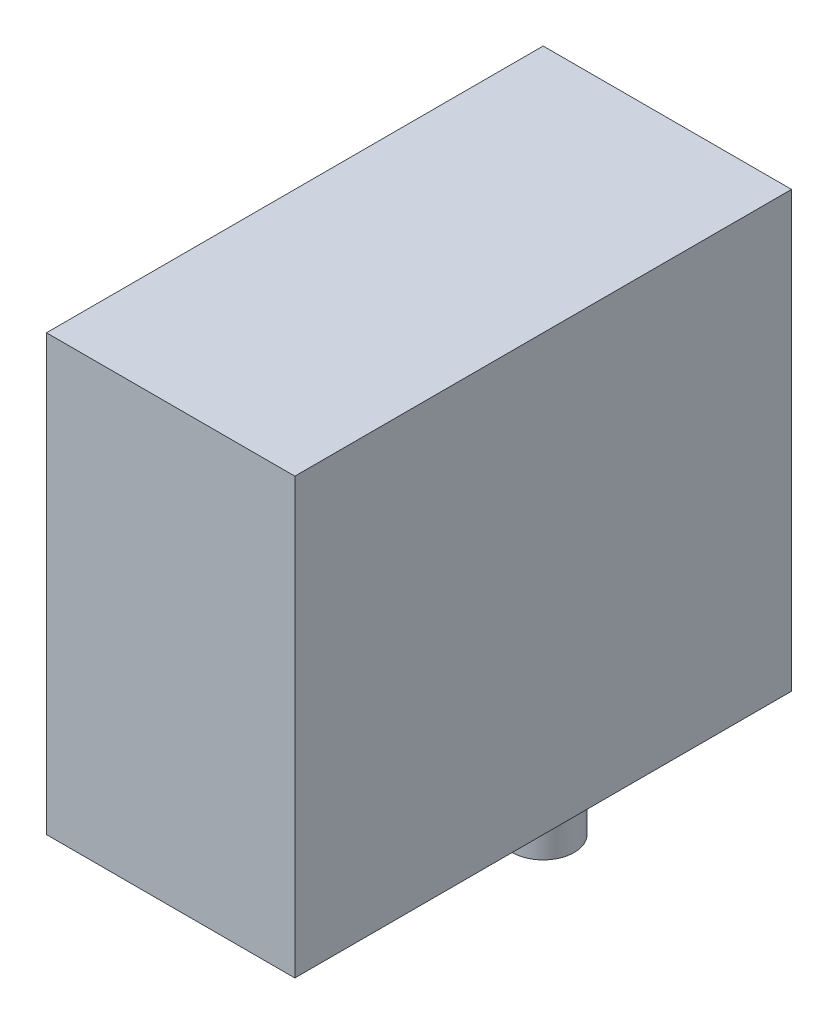
ISO-10303-21;
HEADER;
FILE_DESCRIPTION(('STEP AP214'),'2;1');
FILE_NAME('part.step','',(''),(''),'','','');
FILE_SCHEMA(('AUTOMOTIVE_DESIGN { 1 0 10303 214 1 1 1 1 }'));
ENDSEC;
DATA;
#1=APPLICATION_CONTEXT('core data for automotive mechanical design processes');
#2=APPLICATION_PROTOCOL_DEFINITION('international standard','automotive_design',2000,#1);
#3=PRODUCT_CONTEXT('',#1,'mechanical');
#4=PRODUCT('Part','Part','',(#3));
#5=PRODUCT_RELATED_PRODUCT_CATEGORY('part','',(#4));
#6=PRODUCT_DEFINITION_FORMATION('','',#4);
#7=PRODUCT_DEFINITION_CONTEXT('part definition',#1,'design');
#8=PRODUCT_DEFINITION('design','',#6,#7);
#9=PRODUCT_DEFINITION_SHAPE('','',#8);
#10=(LENGTH_UNIT() NAMED_UNIT(*) SI_UNIT(.MILLI.,.METRE.));
#11=(NAMED_UNIT(*) PLANE_ANGLE_UNIT() SI_UNIT($,.RADIAN.));
#12=(NAMED_UNIT(*) SI_UNIT($,.STERADIAN.) SOLID_ANGLE_UNIT());
#13=UNCERTAINTY_MEASURE_WITH_UNIT(LENGTH_MEASURE(1.E-05),#10,'distance_accuracy_value','');
#14=(GEOMETRIC_REPRESENTATION_CONTEXT(3) GLOBAL_UNCERTAINTY_ASSIGNED_CONTEXT((#13)) GLOBAL_UNIT_ASSIGNED_CONTEXT((#10,
#11,#12)) REPRESENTATION_CONTEXT('',''));
#15=CARTESIAN_POINT('',(0.,0.,0.));
#16=DIRECTION('',(0.,0.,1.));
#17=DIRECTION('',(1.,0.,0.));
#18=AXIS2_PLACEMENT_3D('',#15,#16,#17);
#19=CARTESIAN_POINT('',(0.,10.,0.));
#20=DIRECTION('',(0.,-1.,0.));
#21=DIRECTION('',(0.,0.,-1.));
#22=AXIS2_PLACEMENT_3D('',#19,#20,#21);
#23=CYLINDRICAL_SURFACE('',#22,2.5);
#24=CARTESIAN_POINT('',(0.,10.,0.));
#25=DIRECTION('',(0.,1.,0.));
#26=DIRECTION('',(0.,0.,1.));
#27=AXIS2_PLACEMENT_3D('',#24,#25,#26);
#28=CIRCLE('',#27,2.5);
#29=CARTESIAN_POINT('',(0.,10.,2.5));
#30=VERTEX_POINT('',#29);
#31=EDGE_CURVE('E11',#30,#30,#28,.T.);
#32=ORIENTED_EDGE('',*,*,#31,.F.);
#33=EDGE_LOOP('',(#32));
#34=FACE_BOUND('',#33,.T.);
#35=CARTESIAN_POINT('',(0.,0.,0.));
#36=DIRECTION('',(0.,1.,0.));
#37=DIRECTION('',(0.,0.,1.));
#38=AXIS2_PLACEMENT_3D('',#35,#36,#37);
#39=CIRCLE('',#38,2.5);
#40=CARTESIAN_POINT('',(0.,0.,2.5));
#41=VERTEX_POINT('',#40);
#42=EDGE_CURVE('E39',#41,#41,#39,.T.);
#43=ORIENTED_EDGE('',*,*,#42,.T.);
#44=EDGE_LOOP('',(#43));
#45=FACE_BOUND('',#44,.T.);
#46=ADVANCED_FACE('F36',(#34,#45),#23,.T.);
#47=CARTESIAN_POINT('',(0.,0.,0.));
#48=DIRECTION('',(0.,1.,0.));
#49=DIRECTION('',(0.,0.,1.));
#50=AXIS2_PLACEMENT_3D('',#47,#48,#49);
#51=PLANE('',#50);
#52=ORIENTED_EDGE('',*,*,#42,.F.);
#53=EDGE_LOOP('',(#52));
#54=FACE_BOUND('',#53,.T.);
#55=ADVANCED_FACE('F115',(#54),#51,.F.);
#56=CARTESIAN_POINT('',(10.,45.,-10.));
#57=DIRECTION('',(-1.,0.,0.));
#58=DIRECTION('',(0.,0.,1.));
#59=AXIS2_PLACEMENT_3D('',#56,#57,#58);
#60=PLANE('',#59);
#61=DIRECTION('',(0.,0.,-1.));
#62=VECTOR('',#61,1.);
#63=CARTESIAN_POINT('',(10.,10.,-10.));
#64=LINE('',#63,#62);
#65=CARTESIAN_POINT('',(10.,10.,30.));
#66=VERTEX_POINT('',#65);
#67=CARTESIAN_POINT('',(10.,10.,-10.));
#68=VERTEX_POINT('',#67);
#69=EDGE_CURVE('E103',#66,#68,#64,.T.);
#70=ORIENTED_EDGE('',*,*,#69,.T.);
#71=DIRECTION('',(0.,-1.,0.));
#72=VECTOR('',#71,1.);
#73=CARTESIAN_POINT('',(10.,45.,-10.));
#74=LINE('',#73,#72);
#75=CARTESIAN_POINT('',(10.,45.,-10.));
#76=VERTEX_POINT('',#75);
#77=EDGE_CURVE('E94',#76,#68,#74,.T.);
#78=ORIENTED_EDGE('',*,*,#77,.F.);
#79=DIRECTION('',(0.,0.,-1.));
#80=VECTOR('',#79,1.);
#81=CARTESIAN_POINT('',(10.,45.,-10.));
#82=LINE('',#81,#80);
#83=CARTESIAN_POINT('',(10.,45.,30.));
#84=VERTEX_POINT('',#83);
#85=EDGE_CURVE('E88',#84,#76,#82,.T.);
#86=ORIENTED_EDGE('',*,*,#85,.F.);
#87=DIRECTION('',(0.,-1.,0.));
#88=VECTOR('',#87,1.);
#89=CARTESIAN_POINT('',(10.,45.,30.));
#90=LINE('',#89,#88);
#91=EDGE_CURVE('E99',#84,#66,#90,.T.);
#92=ORIENTED_EDGE('',*,*,#91,.T.);
#93=EDGE_LOOP('',(#70,#78,#86,#92));
#94=FACE_BOUND('',#93,.T.);
#95=ADVANCED_FACE('F117',(#94),#60,.F.);
#96=CARTESIAN_POINT('',(10.,45.,-10.));
#97=DIRECTION('',(0.,0.,1.));
#98=DIRECTION('',(1.,0.,0.));
#99=AXIS2_PLACEMENT_3D('',#96,#97,#98);
#100=PLANE('',#99);
#101=DIRECTION('',(-1.,0.,0.));
#102=VECTOR('',#101,1.);
#103=CARTESIAN_POINT('',(10.,10.,-10.));
#104=LINE('',#103,#102);
#105=CARTESIAN_POINT('',(-10.,10.,-10.));
#106=VERTEX_POINT('',#105);
#107=EDGE_CURVE('E93',#68,#106,#104,.T.);
#108=ORIENTED_EDGE('',*,*,#107,.T.);
#109=DIRECTION('',(0.,-1.,0.));
#110=VECTOR('',#109,1.);
#111=CARTESIAN_POINT('',(-10.,45.,-10.));
#112=LINE('',#111,#110);
#113=CARTESIAN_POINT('',(-10.,45.,-10.));
#114=VERTEX_POINT('',#113);
#115=EDGE_CURVE('E91',#114,#106,#112,.T.);
#116=ORIENTED_EDGE('',*,*,#115,.F.);
#117=DIRECTION('',(-1.,0.,0.));
#118=VECTOR('',#117,1.);
#119=CARTESIAN_POINT('',(10.,45.,-10.));
#120=LINE('',#119,#118);
#121=EDGE_CURVE('E83',#76,#114,#120,.T.);
#122=ORIENTED_EDGE('',*,*,#121,.F.);
#123=ORIENTED_EDGE('',*,*,#77,.T.);
#124=EDGE_LOOP('',(#108,#116,#122,#123));
#125=FACE_BOUND('',#124,.T.);
#126=ADVANCED_FACE('F92',(#125),#100,.F.);
#127=CARTESIAN_POINT('',(-10.,45.,-10.));
#128=DIRECTION('',(1.,0.,0.));
#129=DIRECTION('',(0.,0.,-1.));
#130=AXIS2_PLACEMENT_3D('',#127,#128,#129);
#131=PLANE('',#130);
#132=DIRECTION('',(0.,0.,1.));
#133=VECTOR('',#132,1.);
#134=CARTESIAN_POINT('',(-10.,10.,-10.));
#135=LINE('',#134,#133);
#136=CARTESIAN_POINT('',(-9.99999999999999,10.,30.));
#137=VERTEX_POINT('',#136);
#138=EDGE_CURVE('E69',#106,#137,#135,.T.);
#139=ORIENTED_EDGE('',*,*,#138,.T.);
#140=DIRECTION('',(0.,-1.,0.));
#141=VECTOR('',#140,1.);
#142=CARTESIAN_POINT('',(-9.99999999999999,45.,30.));
#143=LINE('',#142,#141);
#144=CARTESIAN_POINT('',(-9.99999999999999,45.,30.));
#145=VERTEX_POINT('',#144);
#146=EDGE_CURVE('E95',#145,#137,#143,.T.);
#147=ORIENTED_EDGE('',*,*,#146,.F.);
#148=DIRECTION('',(0.,0.,1.));
#149=VECTOR('',#148,1.);
#150=CARTESIAN_POINT('',(-10.,45.,-10.));
#151=LINE('',#150,#149);
#152=EDGE_CURVE('E86',#114,#145,#151,.T.);
#153=ORIENTED_EDGE('',*,*,#152,.F.);
#154=ORIENTED_EDGE('',*,*,#115,.T.);
#155=EDGE_LOOP('',(#139,#147,#153,#154));
#156=FACE_BOUND('',#155,.T.);
#157=ADVANCED_FACE('F97',(#156),#131,.F.);
#158=CARTESIAN_POINT('',(10.,45.,30.));
#159=DIRECTION('',(0.,0.,-1.));
#160=DIRECTION('',(-1.,0.,0.));
#161=AXIS2_PLACEMENT_3D('',#158,#159,#160);
#162=PLANE('',#161);
#163=DIRECTION('',(1.,0.,0.));
#164=VECTOR('',#163,1.);
#165=CARTESIAN_POINT('',(10.,10.,30.));
#166=LINE('',#165,#164);
#167=EDGE_CURVE('E75',#137,#66,#166,.T.);
#168=ORIENTED_EDGE('',*,*,#167,.T.);
#169=ORIENTED_EDGE('',*,*,#91,.F.);
#170=DIRECTION('',(1.,0.,0.));
#171=VECTOR('',#170,1.);
#172=CARTESIAN_POINT('',(10.,45.,30.));
#173=LINE('',#172,#171);
#174=EDGE_CURVE('E52',#145,#84,#173,.T.);
#175=ORIENTED_EDGE('',*,*,#174,.F.);
#176=ORIENTED_EDGE('',*,*,#146,.T.);
#177=EDGE_LOOP('',(#168,#169,#175,#176));
#178=FACE_BOUND('',#177,.T.);
#179=ADVANCED_FACE('F130',(#178),#162,.F.);
#180=CARTESIAN_POINT('',(0.,45.,0.));
#181=DIRECTION('',(0.,-1.,0.));
#182=DIRECTION('',(0.,0.,-1.));
#183=AXIS2_PLACEMENT_3D('',#180,#181,#182);
#184=PLANE('',#183);
#185=ORIENTED_EDGE('',*,*,#85,.T.);
#186=ORIENTED_EDGE('',*,*,#121,.T.);
#187=ORIENTED_EDGE('',*,*,#152,.T.);
#188=ORIENTED_EDGE('',*,*,#174,.T.);
#189=EDGE_LOOP('',(#185,#186,#187,#188));
#190=FACE_BOUND('',#189,.T.);
#191=ADVANCED_FACE('F84',(#190),#184,.F.);
#192=CARTESIAN_POINT('',(0.,10.,0.));
#193=DIRECTION('',(0.,-1.,0.));
#194=DIRECTION('',(0.,0.,-1.));
#195=AXIS2_PLACEMENT_3D('',#192,#193,#194);
#196=PLANE('',#195);
#197=ORIENTED_EDGE('',*,*,#31,.T.);
#198=EDGE_LOOP('',(#197));
#199=FACE_BOUND('',#198,.T.);
#200=ORIENTED_EDGE('',*,*,#69,.F.);
#201=ORIENTED_EDGE('',*,*,#167,.F.);
#202=ORIENTED_EDGE('',*,*,#138,.F.);
#203=ORIENTED_EDGE('',*,*,#107,.F.);
#204=EDGE_LOOP('',(#200,#201,#202,#203));
#205=FACE_BOUND('',#204,.T.);
#206=ADVANCED_FACE('F133',(#199,#205),#196,.T.);
#207=CLOSED_SHELL('',(#46,#55,#95,#126,#157,#179,#191,#206));
#208=MANIFOLD_SOLID_BREP('B2',#207);
#209=ADVANCED_BREP_SHAPE_REPRESENTATION('',(#18,#208),#14);
#210=SHAPE_DEFINITION_REPRESENTATION(#9,#209);
ENDSEC;
END-ISO-10303-21;
